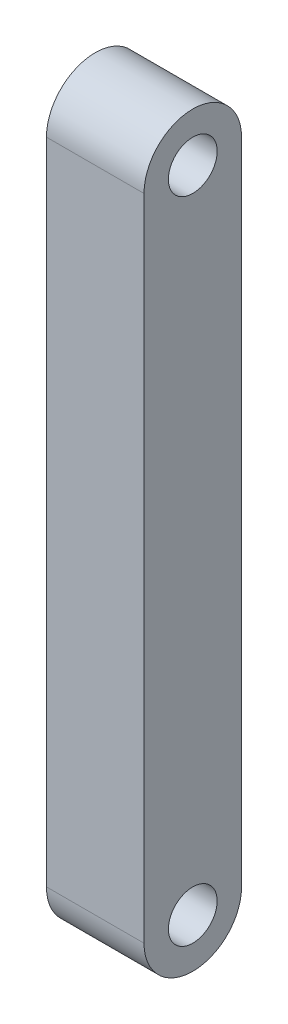
ISO-10303-21;
HEADER;
FILE_DESCRIPTION(('STEP AP214'),'2;1');
FILE_NAME('part.step','',(''),(''),'','','');
FILE_SCHEMA(('AUTOMOTIVE_DESIGN { 1 0 10303 214 1 1 1 1 }'));
ENDSEC;
DATA;
#1=APPLICATION_CONTEXT('core data for automotive mechanical design processes');
#2=APPLICATION_PROTOCOL_DEFINITION('international standard','automotive_design',2000,#1);
#3=PRODUCT_CONTEXT('',#1,'mechanical');
#4=PRODUCT('Part','Part','',(#3));
#5=PRODUCT_RELATED_PRODUCT_CATEGORY('part','',(#4));
#6=PRODUCT_DEFINITION_FORMATION('','',#4);
#7=PRODUCT_DEFINITION_CONTEXT('part definition',#1,'design');
#8=PRODUCT_DEFINITION('design','',#6,#7);
#9=PRODUCT_DEFINITION_SHAPE('','',#8);
#10=(LENGTH_UNIT() NAMED_UNIT(*) SI_UNIT(.MILLI.,.METRE.));
#11=(NAMED_UNIT(*) PLANE_ANGLE_UNIT() SI_UNIT($,.RADIAN.));
#12=(NAMED_UNIT(*) SI_UNIT($,.STERADIAN.) SOLID_ANGLE_UNIT());
#13=UNCERTAINTY_MEASURE_WITH_UNIT(LENGTH_MEASURE(1.E-05),#10,'distance_accuracy_value','');
#14=(GEOMETRIC_REPRESENTATION_CONTEXT(3) GLOBAL_UNCERTAINTY_ASSIGNED_CONTEXT((#13)) GLOBAL_UNIT_ASSIGNED_CONTEXT((#10,
#11,#12)) REPRESENTATION_CONTEXT('',''));
#15=CARTESIAN_POINT('',(0.,0.,0.));
#16=DIRECTION('',(0.,0.,1.));
#17=DIRECTION('',(1.,0.,0.));
#18=AXIS2_PLACEMENT_3D('',#15,#16,#17);
#19=CARTESIAN_POINT('',(4.,-13.31,-1.61881492984884));
#20=DIRECTION('',(1.,0.,0.));
#21=DIRECTION('',(0.,0.,-1.));
#22=AXIS2_PLACEMENT_3D('',#19,#20,#21);
#23=PLANE('',#22);
#24=CARTESIAN_POINT('',(4.,13.31,-1.61881492984884));
#25=DIRECTION('',(1.,0.,0.));
#26=DIRECTION('',(0.,0.,-1.));
#27=AXIS2_PLACEMENT_3D('',#24,#25,#26);
#28=CIRCLE('',#27,1.);
#29=CARTESIAN_POINT('',(4.,13.31,-2.61881492984884));
#30=VERTEX_POINT('',#29);
#31=EDGE_CURVE('E99',#30,#30,#28,.T.);
#32=ORIENTED_EDGE('',*,*,#31,.F.);
#33=EDGE_LOOP('',(#32));
#34=FACE_BOUND('',#33,.T.);
#35=CARTESIAN_POINT('',(4.,-13.31,-1.61881492984884));
#36=DIRECTION('',(1.,0.,0.));
#37=DIRECTION('',(0.,0.,-1.));
#38=AXIS2_PLACEMENT_3D('',#35,#36,#37);
#39=CIRCLE('',#38,2.);
#40=CARTESIAN_POINT('',(4.,-13.31,0.38118507015116));
#41=VERTEX_POINT('',#40);
#42=CARTESIAN_POINT('',(4.,-13.31,-3.61881492984884));
#43=VERTEX_POINT('',#42);
#44=EDGE_CURVE('E84',#41,#43,#39,.T.);
#45=ORIENTED_EDGE('',*,*,#44,.T.);
#46=DIRECTION('',(0.,1.,0.));
#47=VECTOR('',#46,1.);
#48=CARTESIAN_POINT('',(4.,-13.31,-3.61881492984884));
#49=LINE('',#48,#47);
#50=CARTESIAN_POINT('',(4.,13.31,-3.61881492984884));
#51=VERTEX_POINT('',#50);
#52=EDGE_CURVE('E79',#43,#51,#49,.T.);
#53=ORIENTED_EDGE('',*,*,#52,.T.);
#54=CARTESIAN_POINT('',(4.,13.31,-1.61881492984884));
#55=DIRECTION('',(1.,0.,0.));
#56=DIRECTION('',(0.,0.,-1.));
#57=AXIS2_PLACEMENT_3D('',#54,#55,#56);
#58=CIRCLE('',#57,2.);
#59=CARTESIAN_POINT('',(4.,13.31,0.38118507015116));
#60=VERTEX_POINT('',#59);
#61=EDGE_CURVE('E82',#51,#60,#58,.T.);
#62=ORIENTED_EDGE('',*,*,#61,.T.);
#63=DIRECTION('',(0.,-1.,0.));
#64=VECTOR('',#63,1.);
#65=CARTESIAN_POINT('',(4.,-13.31,0.38118507015116));
#66=LINE('',#65,#64);
#67=EDGE_CURVE('E49',#60,#41,#66,.T.);
#68=ORIENTED_EDGE('',*,*,#67,.T.);
#69=EDGE_LOOP('',(#45,#53,#62,#68));
#70=FACE_BOUND('',#69,.T.);
#71=CARTESIAN_POINT('',(4.,-13.31,-1.61881492984884));
#72=DIRECTION('',(1.,0.,0.));
#73=DIRECTION('',(0.,0.,-1.));
#74=AXIS2_PLACEMENT_3D('',#71,#72,#73);
#75=CIRCLE('',#74,1.);
#76=CARTESIAN_POINT('',(4.,-13.31,-2.61881492984884));
#77=VERTEX_POINT('',#76);
#78=EDGE_CURVE('E114',#77,#77,#75,.T.);
#79=ORIENTED_EDGE('',*,*,#78,.F.);
#80=EDGE_LOOP('',(#79));
#81=FACE_BOUND('',#80,.T.);
#82=ADVANCED_FACE('F32',(#34,#70,#81),#23,.T.);
#83=CARTESIAN_POINT('',(0.,-13.31,-1.61881492984884));
#84=DIRECTION('',(1.,0.,0.));
#85=DIRECTION('',(0.,0.,-1.));
#86=AXIS2_PLACEMENT_3D('',#83,#84,#85);
#87=PLANE('',#86);
#88=CARTESIAN_POINT('',(0.,-13.31,-1.61881492984884));
#89=DIRECTION('',(1.,0.,0.));
#90=DIRECTION('',(0.,0.,-1.));
#91=AXIS2_PLACEMENT_3D('',#88,#89,#90);
#92=CIRCLE('',#91,2.);
#93=CARTESIAN_POINT('',(0.,-13.31,0.38118507015116));
#94=VERTEX_POINT('',#93);
#95=CARTESIAN_POINT('',(0.,-13.31,-3.61881492984884));
#96=VERTEX_POINT('',#95);
#97=EDGE_CURVE('E96',#94,#96,#92,.T.);
#98=ORIENTED_EDGE('',*,*,#97,.F.);
#99=DIRECTION('',(0.,-1.,0.));
#100=VECTOR('',#99,1.);
#101=CARTESIAN_POINT('',(0.,-13.31,0.38118507015116));
#102=LINE('',#101,#100);
#103=CARTESIAN_POINT('',(0.,13.31,0.38118507015116));
#104=VERTEX_POINT('',#103);
#105=EDGE_CURVE('E72',#104,#94,#102,.T.);
#106=ORIENTED_EDGE('',*,*,#105,.F.);
#107=CARTESIAN_POINT('',(0.,13.31,-1.61881492984884));
#108=DIRECTION('',(1.,0.,0.));
#109=DIRECTION('',(0.,0.,-1.));
#110=AXIS2_PLACEMENT_3D('',#107,#108,#109);
#111=CIRCLE('',#110,2.);
#112=CARTESIAN_POINT('',(0.,13.31,-3.61881492984884));
#113=VERTEX_POINT('',#112);
#114=EDGE_CURVE('E66',#113,#104,#111,.T.);
#115=ORIENTED_EDGE('',*,*,#114,.F.);
#116=DIRECTION('',(0.,1.,0.));
#117=VECTOR('',#116,1.);
#118=CARTESIAN_POINT('',(0.,-13.31,-3.61881492984884));
#119=LINE('',#118,#117);
#120=EDGE_CURVE('E88',#96,#113,#119,.T.);
#121=ORIENTED_EDGE('',*,*,#120,.F.);
#122=EDGE_LOOP('',(#98,#106,#115,#121));
#123=FACE_BOUND('',#122,.T.);
#124=CARTESIAN_POINT('',(0.,13.31,-1.61881492984884));
#125=DIRECTION('',(1.,0.,0.));
#126=DIRECTION('',(0.,0.,-1.));
#127=AXIS2_PLACEMENT_3D('',#124,#125,#126);
#128=CIRCLE('',#127,1.);
#129=CARTESIAN_POINT('',(0.,13.31,-2.61881492984884));
#130=VERTEX_POINT('',#129);
#131=EDGE_CURVE('E111',#130,#130,#128,.T.);
#132=ORIENTED_EDGE('',*,*,#131,.T.);
#133=EDGE_LOOP('',(#132));
#134=FACE_BOUND('',#133,.T.);
#135=CARTESIAN_POINT('',(0.,-13.31,-1.61881492984884));
#136=DIRECTION('',(1.,0.,0.));
#137=DIRECTION('',(0.,0.,-1.));
#138=AXIS2_PLACEMENT_3D('',#135,#136,#137);
#139=CIRCLE('',#138,1.);
#140=CARTESIAN_POINT('',(0.,-13.31,-2.61881492984884));
#141=VERTEX_POINT('',#140);
#142=EDGE_CURVE('E117',#141,#141,#139,.T.);
#143=ORIENTED_EDGE('',*,*,#142,.T.);
#144=EDGE_LOOP('',(#143));
#145=FACE_BOUND('',#144,.T.);
#146=ADVANCED_FACE('F107',(#123,#134,#145),#87,.F.);
#147=CARTESIAN_POINT('',(4.,-13.31,-1.61881492984884));
#148=DIRECTION('',(-1.,0.,0.));
#149=DIRECTION('',(0.,0.,1.));
#150=AXIS2_PLACEMENT_3D('',#147,#148,#149);
#151=CYLINDRICAL_SURFACE('',#150,2.);
#152=ORIENTED_EDGE('',*,*,#97,.T.);
#153=DIRECTION('',(-1.,0.,0.));
#154=VECTOR('',#153,1.);
#155=CARTESIAN_POINT('',(4.,-13.31,-3.61881492984884));
#156=LINE('',#155,#154);
#157=EDGE_CURVE('E11',#43,#96,#156,.T.);
#158=ORIENTED_EDGE('',*,*,#157,.F.);
#159=ORIENTED_EDGE('',*,*,#44,.F.);
#160=DIRECTION('',(-1.,0.,0.));
#161=VECTOR('',#160,1.);
#162=CARTESIAN_POINT('',(4.,-13.31,0.38118507015116));
#163=LINE('',#162,#161);
#164=EDGE_CURVE('E92',#41,#94,#163,.T.);
#165=ORIENTED_EDGE('',*,*,#164,.T.);
#166=EDGE_LOOP('',(#152,#158,#159,#165));
#167=FACE_BOUND('',#166,.T.);
#168=ADVANCED_FACE('F34',(#167),#151,.T.);
#169=CARTESIAN_POINT('',(4.,-13.31,-3.61881492984884));
#170=DIRECTION('',(0.,0.,1.));
#171=DIRECTION('',(0.,-1.,0.));
#172=AXIS2_PLACEMENT_3D('',#169,#170,#171);
#173=PLANE('',#172);
#174=ORIENTED_EDGE('',*,*,#120,.T.);
#175=DIRECTION('',(-1.,0.,0.));
#176=VECTOR('',#175,1.);
#177=CARTESIAN_POINT('',(4.,13.31,-3.61881492984884));
#178=LINE('',#177,#176);
#179=EDGE_CURVE('E41',#51,#113,#178,.T.);
#180=ORIENTED_EDGE('',*,*,#179,.F.);
#181=ORIENTED_EDGE('',*,*,#52,.F.);
#182=ORIENTED_EDGE('',*,*,#157,.T.);
#183=EDGE_LOOP('',(#174,#180,#181,#182));
#184=FACE_BOUND('',#183,.T.);
#185=ADVANCED_FACE('F87',(#184),#173,.F.);
#186=CARTESIAN_POINT('',(4.,13.31,-1.61881492984884));
#187=DIRECTION('',(-1.,0.,0.));
#188=DIRECTION('',(0.,0.,1.));
#189=AXIS2_PLACEMENT_3D('',#186,#187,#188);
#190=CYLINDRICAL_SURFACE('',#189,2.);
#191=ORIENTED_EDGE('',*,*,#114,.T.);
#192=DIRECTION('',(-1.,0.,0.));
#193=VECTOR('',#192,1.);
#194=CARTESIAN_POINT('',(4.,13.31,0.38118507015116));
#195=LINE('',#194,#193);
#196=EDGE_CURVE('E89',#60,#104,#195,.T.);
#197=ORIENTED_EDGE('',*,*,#196,.F.);
#198=ORIENTED_EDGE('',*,*,#61,.F.);
#199=ORIENTED_EDGE('',*,*,#179,.T.);
#200=EDGE_LOOP('',(#191,#197,#198,#199));
#201=FACE_BOUND('',#200,.T.);
#202=ADVANCED_FACE('F90',(#201),#190,.T.);
#203=CARTESIAN_POINT('',(4.,-13.31,0.38118507015116));
#204=DIRECTION('',(0.,0.,-1.));
#205=DIRECTION('',(-1.,0.,0.));
#206=AXIS2_PLACEMENT_3D('',#203,#204,#205);
#207=PLANE('',#206);
#208=ORIENTED_EDGE('',*,*,#105,.T.);
#209=ORIENTED_EDGE('',*,*,#164,.F.);
#210=ORIENTED_EDGE('',*,*,#67,.F.);
#211=ORIENTED_EDGE('',*,*,#196,.T.);
#212=EDGE_LOOP('',(#208,#209,#210,#211));
#213=FACE_BOUND('',#212,.T.);
#214=ADVANCED_FACE('F104',(#213),#207,.F.);
#215=CARTESIAN_POINT('',(4.,13.31,-1.61881492984884));
#216=DIRECTION('',(-1.,0.,0.));
#217=DIRECTION('',(0.,0.,1.));
#218=AXIS2_PLACEMENT_3D('',#215,#216,#217);
#219=CYLINDRICAL_SURFACE('',#218,1.);
#220=ORIENTED_EDGE('',*,*,#31,.T.);
#221=EDGE_LOOP('',(#220));
#222=FACE_BOUND('',#221,.T.);
#223=ORIENTED_EDGE('',*,*,#131,.F.);
#224=EDGE_LOOP('',(#223));
#225=FACE_BOUND('',#224,.T.);
#226=ADVANCED_FACE('F134',(#222,#225),#219,.F.);
#227=CARTESIAN_POINT('',(4.,-13.31,-1.61881492984884));
#228=DIRECTION('',(-1.,0.,0.));
#229=DIRECTION('',(0.,0.,1.));
#230=AXIS2_PLACEMENT_3D('',#227,#228,#229);
#231=CYLINDRICAL_SURFACE('',#230,1.);
#232=ORIENTED_EDGE('',*,*,#78,.T.);
#233=EDGE_LOOP('',(#232));
#234=FACE_BOUND('',#233,.T.);
#235=ORIENTED_EDGE('',*,*,#142,.F.);
#236=EDGE_LOOP('',(#235));
#237=FACE_BOUND('',#236,.T.);
#238=ADVANCED_FACE('F123',(#234,#237),#231,.F.);
#239=CLOSED_SHELL('',(#82,#146,#168,#185,#202,#214,#226,#238));
#240=MANIFOLD_SOLID_BREP('B2',#239);
#241=ADVANCED_BREP_SHAPE_REPRESENTATION('',(#18,#240),#14);
#242=SHAPE_DEFINITION_REPRESENTATION(#9,#241);
ENDSEC;
END-ISO-10303-21;
